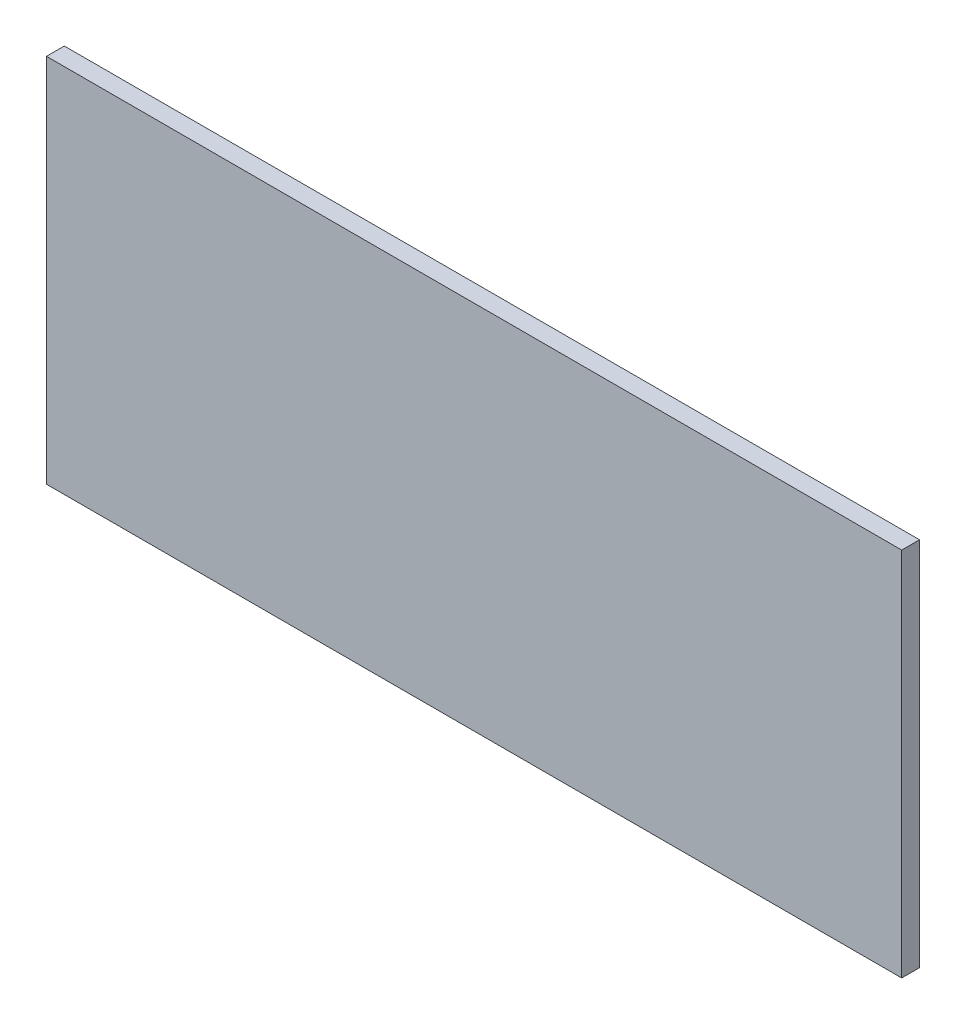
ISO-10303-21;
HEADER;
FILE_DESCRIPTION(('STEP AP214'),'2;1');
FILE_NAME('part.step','',(''),(''),'','','');
FILE_SCHEMA(('AUTOMOTIVE_DESIGN { 1 0 10303 214 1 1 1 1 }'));
ENDSEC;
DATA;
#1=APPLICATION_CONTEXT('core data for automotive mechanical design processes');
#2=APPLICATION_PROTOCOL_DEFINITION('international standard','automotive_design',2000,#1);
#3=PRODUCT_CONTEXT('',#1,'mechanical');
#4=PRODUCT('Part','Part','',(#3));
#5=PRODUCT_RELATED_PRODUCT_CATEGORY('part','',(#4));
#6=PRODUCT_DEFINITION_FORMATION('','',#4);
#7=PRODUCT_DEFINITION_CONTEXT('part definition',#1,'design');
#8=PRODUCT_DEFINITION('design','',#6,#7);
#9=PRODUCT_DEFINITION_SHAPE('','',#8);
#10=(LENGTH_UNIT() NAMED_UNIT(*) SI_UNIT(.MILLI.,.METRE.));
#11=(NAMED_UNIT(*) PLANE_ANGLE_UNIT() SI_UNIT($,.RADIAN.));
#12=(NAMED_UNIT(*) SI_UNIT($,.STERADIAN.) SOLID_ANGLE_UNIT());
#13=UNCERTAINTY_MEASURE_WITH_UNIT(LENGTH_MEASURE(1.E-05),#10,'distance_accuracy_value','');
#14=(GEOMETRIC_REPRESENTATION_CONTEXT(3) GLOBAL_UNCERTAINTY_ASSIGNED_CONTEXT((#13)) GLOBAL_UNIT_ASSIGNED_CONTEXT((#10,
#11,#12)) REPRESENTATION_CONTEXT('',''));
#15=CARTESIAN_POINT('',(0.,0.,0.));
#16=DIRECTION('',(0.,0.,1.));
#17=DIRECTION('',(1.,0.,0.));
#18=AXIS2_PLACEMENT_3D('',#15,#16,#17);
#19=CARTESIAN_POINT('',(0.,0.,3.175));
#20=DIRECTION('',(-1.,0.,0.));
#21=DIRECTION('',(0.,0.,1.));
#22=AXIS2_PLACEMENT_3D('',#19,#20,#21);
#23=PLANE('',#22);
#24=DIRECTION('',(0.,1.,0.));
#25=VECTOR('',#24,1.);
#26=CARTESIAN_POINT('',(0.,0.,0.));
#27=LINE('',#26,#25);
#28=CARTESIAN_POINT('',(0.,0.,0.));
#29=VERTEX_POINT('',#28);
#30=CARTESIAN_POINT('',(0.,66.04,0.));
#31=VERTEX_POINT('',#30);
#32=EDGE_CURVE('E111',#29,#31,#27,.T.);
#33=ORIENTED_EDGE('',*,*,#32,.T.);
#34=DIRECTION('',(0.,0.,-1.));
#35=VECTOR('',#34,1.);
#36=CARTESIAN_POINT('',(0.,66.04,3.175));
#37=LINE('',#36,#35);
#38=CARTESIAN_POINT('',(0.,66.04,3.175));
#39=VERTEX_POINT('',#38);
#40=EDGE_CURVE('E11',#39,#31,#37,.T.);
#41=ORIENTED_EDGE('',*,*,#40,.F.);
#42=DIRECTION('',(0.,1.,0.));
#43=VECTOR('',#42,1.);
#44=CARTESIAN_POINT('',(0.,0.,3.175));
#45=LINE('',#44,#43);
#46=CARTESIAN_POINT('',(0.,0.,3.175));
#47=VERTEX_POINT('',#46);
#48=EDGE_CURVE('E95',#47,#39,#45,.T.);
#49=ORIENTED_EDGE('',*,*,#48,.F.);
#50=DIRECTION('',(0.,0.,-1.));
#51=VECTOR('',#50,1.);
#52=CARTESIAN_POINT('',(0.,0.,3.175));
#53=LINE('',#52,#51);
#54=EDGE_CURVE('E107',#47,#29,#53,.T.);
#55=ORIENTED_EDGE('',*,*,#54,.T.);
#56=EDGE_LOOP('',(#33,#41,#49,#55));
#57=FACE_BOUND('',#56,.T.);
#58=ADVANCED_FACE('F43',(#57),#23,.F.);
#59=CARTESIAN_POINT('',(0.,66.04,3.175));
#60=DIRECTION('',(0.,-1.,0.));
#61=DIRECTION('',(1.,0.,0.));
#62=AXIS2_PLACEMENT_3D('',#59,#60,#61);
#63=PLANE('',#62);
#64=DIRECTION('',(-1.,0.,0.));
#65=VECTOR('',#64,1.);
#66=CARTESIAN_POINT('',(0.,66.04,0.));
#67=LINE('',#66,#65);
#68=CARTESIAN_POINT('',(-152.4,66.04,0.));
#69=VERTEX_POINT('',#68);
#70=EDGE_CURVE('E100',#31,#69,#67,.T.);
#71=ORIENTED_EDGE('',*,*,#70,.T.);
#72=DIRECTION('',(0.,0.,-1.));
#73=VECTOR('',#72,1.);
#74=CARTESIAN_POINT('',(-152.4,66.04,3.175));
#75=LINE('',#74,#73);
#76=CARTESIAN_POINT('',(-152.4,66.04,3.175));
#77=VERTEX_POINT('',#76);
#78=EDGE_CURVE('E52',#77,#69,#75,.T.);
#79=ORIENTED_EDGE('',*,*,#78,.F.);
#80=DIRECTION('',(-1.,0.,0.));
#81=VECTOR('',#80,1.);
#82=CARTESIAN_POINT('',(0.,66.04,3.175));
#83=LINE('',#82,#81);
#84=EDGE_CURVE('E90',#39,#77,#83,.T.);
#85=ORIENTED_EDGE('',*,*,#84,.F.);
#86=ORIENTED_EDGE('',*,*,#40,.T.);
#87=EDGE_LOOP('',(#71,#79,#85,#86));
#88=FACE_BOUND('',#87,.T.);
#89=ADVANCED_FACE('F99',(#88),#63,.F.);
#90=CARTESIAN_POINT('',(-152.4,0.,3.175));
#91=DIRECTION('',(1.,0.,0.));
#92=DIRECTION('',(0.,0.,-1.));
#93=AXIS2_PLACEMENT_3D('',#90,#91,#92);
#94=PLANE('',#93);
#95=DIRECTION('',(0.,-1.,0.));
#96=VECTOR('',#95,1.);
#97=CARTESIAN_POINT('',(-152.4,0.,0.));
#98=LINE('',#97,#96);
#99=CARTESIAN_POINT('',(-152.4,0.,0.));
#100=VERTEX_POINT('',#99);
#101=EDGE_CURVE('E77',#69,#100,#98,.T.);
#102=ORIENTED_EDGE('',*,*,#101,.T.);
#103=DIRECTION('',(0.,0.,-1.));
#104=VECTOR('',#103,1.);
#105=CARTESIAN_POINT('',(-152.4,0.,3.175));
#106=LINE('',#105,#104);
#107=CARTESIAN_POINT('',(-152.4,0.,3.175));
#108=VERTEX_POINT('',#107);
#109=EDGE_CURVE('E102',#108,#100,#106,.T.);
#110=ORIENTED_EDGE('',*,*,#109,.F.);
#111=DIRECTION('',(0.,-1.,0.));
#112=VECTOR('',#111,1.);
#113=CARTESIAN_POINT('',(-152.4,0.,3.175));
#114=LINE('',#113,#112);
#115=EDGE_CURVE('E93',#77,#108,#114,.T.);
#116=ORIENTED_EDGE('',*,*,#115,.F.);
#117=ORIENTED_EDGE('',*,*,#78,.T.);
#118=EDGE_LOOP('',(#102,#110,#116,#117));
#119=FACE_BOUND('',#118,.T.);
#120=ADVANCED_FACE('F103',(#119),#94,.F.);
#121=CARTESIAN_POINT('',(0.,0.,3.175));
#122=DIRECTION('',(0.,1.,0.));
#123=DIRECTION('',(-1.,0.,0.));
#124=AXIS2_PLACEMENT_3D('',#121,#122,#123);
#125=PLANE('',#124);
#126=DIRECTION('',(1.,0.,0.));
#127=VECTOR('',#126,1.);
#128=CARTESIAN_POINT('',(0.,0.,0.));
#129=LINE('',#128,#127);
#130=EDGE_CURVE('E83',#100,#29,#129,.T.);
#131=ORIENTED_EDGE('',*,*,#130,.T.);
#132=ORIENTED_EDGE('',*,*,#54,.F.);
#133=DIRECTION('',(1.,0.,0.));
#134=VECTOR('',#133,1.);
#135=CARTESIAN_POINT('',(0.,0.,3.175));
#136=LINE('',#135,#134);
#137=EDGE_CURVE('E60',#108,#47,#136,.T.);
#138=ORIENTED_EDGE('',*,*,#137,.F.);
#139=ORIENTED_EDGE('',*,*,#109,.T.);
#140=EDGE_LOOP('',(#131,#132,#138,#139));
#141=FACE_BOUND('',#140,.T.);
#142=ADVANCED_FACE('F124',(#141),#125,.F.);
#143=CARTESIAN_POINT('',(0.,0.,3.175));
#144=DIRECTION('',(0.,0.,1.));
#145=DIRECTION('',(1.,0.,0.));
#146=AXIS2_PLACEMENT_3D('',#143,#144,#145);
#147=PLANE('',#146);
#148=ORIENTED_EDGE('',*,*,#48,.T.);
#149=ORIENTED_EDGE('',*,*,#84,.T.);
#150=ORIENTED_EDGE('',*,*,#115,.T.);
#151=ORIENTED_EDGE('',*,*,#137,.T.);
#152=EDGE_LOOP('',(#148,#149,#150,#151));
#153=FACE_BOUND('',#152,.T.);
#154=ADVANCED_FACE('F91',(#153),#147,.T.);
#155=CARTESIAN_POINT('',(0.,0.,0.));
#156=DIRECTION('',(0.,0.,1.));
#157=DIRECTION('',(1.,0.,0.));
#158=AXIS2_PLACEMENT_3D('',#155,#156,#157);
#159=PLANE('',#158);
#160=ORIENTED_EDGE('',*,*,#32,.F.);
#161=ORIENTED_EDGE('',*,*,#130,.F.);
#162=ORIENTED_EDGE('',*,*,#101,.F.);
#163=ORIENTED_EDGE('',*,*,#70,.F.);
#164=EDGE_LOOP('',(#160,#161,#162,#163));
#165=FACE_BOUND('',#164,.T.);
#166=ADVANCED_FACE('F127',(#165),#159,.F.);
#167=CLOSED_SHELL('',(#58,#89,#120,#142,#154,#166));
#168=MANIFOLD_SOLID_BREP('B2',#167);
#169=ADVANCED_BREP_SHAPE_REPRESENTATION('',(#18,#168),#14);
#170=SHAPE_DEFINITION_REPRESENTATION(#9,#169);
ENDSEC;
END-ISO-10303-21;
